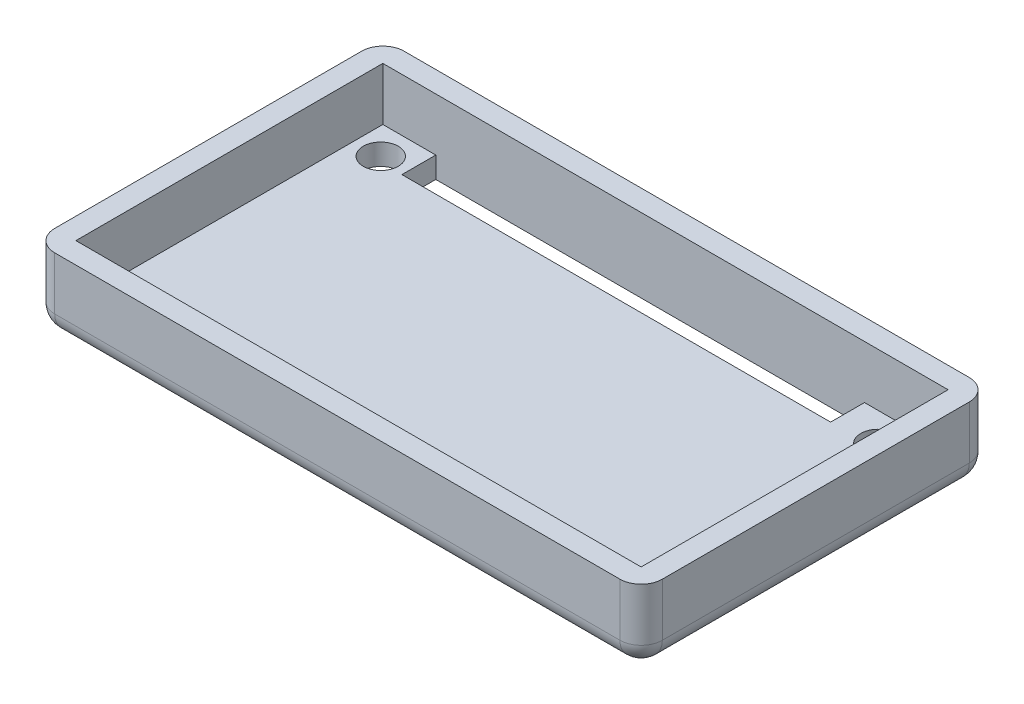
ISO-10303-21;
HEADER;
FILE_DESCRIPTION(('STEP AP214'),'2;1');
FILE_NAME('part.step','',(''),(''),'','','');
FILE_SCHEMA(('AUTOMOTIVE_DESIGN { 1 0 10303 214 1 1 1 1 }'));
ENDSEC;
DATA;
#1=APPLICATION_CONTEXT('core data for automotive mechanical design processes');
#2=APPLICATION_PROTOCOL_DEFINITION('international standard','automotive_design',2000,#1);
#3=PRODUCT_CONTEXT('',#1,'mechanical');
#4=PRODUCT('Part','Part','',(#3));
#5=PRODUCT_RELATED_PRODUCT_CATEGORY('part','',(#4));
#6=PRODUCT_DEFINITION_FORMATION('','',#4);
#7=PRODUCT_DEFINITION_CONTEXT('part definition',#1,'design');
#8=PRODUCT_DEFINITION('design','',#6,#7);
#9=PRODUCT_DEFINITION_SHAPE('','',#8);
#10=(LENGTH_UNIT() NAMED_UNIT(*) SI_UNIT(.MILLI.,.METRE.));
#11=(NAMED_UNIT(*) PLANE_ANGLE_UNIT() SI_UNIT($,.RADIAN.));
#12=(NAMED_UNIT(*) SI_UNIT($,.STERADIAN.) SOLID_ANGLE_UNIT());
#13=UNCERTAINTY_MEASURE_WITH_UNIT(LENGTH_MEASURE(1.E-05),#10,'distance_accuracy_value','');
#14=(GEOMETRIC_REPRESENTATION_CONTEXT(3) GLOBAL_UNCERTAINTY_ASSIGNED_CONTEXT((#13)) GLOBAL_UNIT_ASSIGNED_CONTEXT((#10,
#11,#12)) REPRESENTATION_CONTEXT('',''));
#15=CARTESIAN_POINT('',(0.,0.,0.));
#16=DIRECTION('',(0.,0.,1.));
#17=DIRECTION('',(1.,0.,0.));
#18=AXIS2_PLACEMENT_3D('',#15,#16,#17);
#19=CARTESIAN_POINT('',(0.,7.,0.));
#20=DIRECTION('',(0.,-1.,0.));
#21=DIRECTION('',(0.,0.,-1.));
#22=AXIS2_PLACEMENT_3D('',#19,#20,#21);
#23=PLANE('',#22);
#24=DIRECTION('',(0.,0.,-1.));
#25=VECTOR('',#24,1.);
#26=CARTESIAN_POINT('',(57.4,7.,0.));
#27=LINE('',#26,#25);
#28=CARTESIAN_POINT('',(57.4,7.,-2.));
#29=VERTEX_POINT('',#28);
#30=CARTESIAN_POINT('',(57.4,7.,-31.));
#31=VERTEX_POINT('',#30);
#32=EDGE_CURVE('E317',#29,#31,#27,.T.);
#33=ORIENTED_EDGE('',*,*,#32,.T.);
#34=CARTESIAN_POINT('',(55.4,7.,-31.));
#35=DIRECTION('',(0.,-1.,0.));
#36=DIRECTION('',(0.,0.,-1.));
#37=AXIS2_PLACEMENT_3D('',#34,#35,#36);
#38=CIRCLE('',#37,2.);
#39=CARTESIAN_POINT('',(55.4,7.,-33.));
#40=VERTEX_POINT('',#39);
#41=EDGE_CURVE('E11',#31,#40,#38,.F.);
#42=ORIENTED_EDGE('',*,*,#41,.T.);
#43=DIRECTION('',(-1.,0.,0.));
#44=VECTOR('',#43,1.);
#45=CARTESIAN_POINT('',(0.,7.,-33.));
#46=LINE('',#45,#44);
#47=CARTESIAN_POINT('',(2.,7.,-33.));
#48=VERTEX_POINT('',#47);
#49=EDGE_CURVE('E320',#40,#48,#46,.T.);
#50=ORIENTED_EDGE('',*,*,#49,.T.);
#51=CARTESIAN_POINT('',(2.,7.,-31.));
#52=DIRECTION('',(0.,-1.,0.));
#53=DIRECTION('',(0.,0.,-1.));
#54=AXIS2_PLACEMENT_3D('',#51,#52,#53);
#55=CIRCLE('',#54,2.);
#56=CARTESIAN_POINT('',(0.,7.,-31.));
#57=VERTEX_POINT('',#56);
#58=EDGE_CURVE('E46',#48,#57,#55,.F.);
#59=ORIENTED_EDGE('',*,*,#58,.T.);
#60=DIRECTION('',(0.,0.,1.));
#61=VECTOR('',#60,1.);
#62=CARTESIAN_POINT('',(0.,7.,0.));
#63=LINE('',#62,#61);
#64=CARTESIAN_POINT('',(0.,7.,-2.));
#65=VERTEX_POINT('',#64);
#66=EDGE_CURVE('E311',#57,#65,#63,.T.);
#67=ORIENTED_EDGE('',*,*,#66,.T.);
#68=CARTESIAN_POINT('',(2.,7.,-2.));
#69=DIRECTION('',(0.,-1.,0.));
#70=DIRECTION('',(0.,0.,-1.));
#71=AXIS2_PLACEMENT_3D('',#68,#69,#70);
#72=CIRCLE('',#71,2.);
#73=CARTESIAN_POINT('',(2.,7.,0.));
#74=VERTEX_POINT('',#73);
#75=EDGE_CURVE('E358',#65,#74,#72,.F.);
#76=ORIENTED_EDGE('',*,*,#75,.T.);
#77=DIRECTION('',(1.,0.,0.));
#78=VECTOR('',#77,1.);
#79=CARTESIAN_POINT('',(0.,7.,0.));
#80=LINE('',#79,#78);
#81=CARTESIAN_POINT('',(55.4,7.,0.));
#82=VERTEX_POINT('',#81);
#83=EDGE_CURVE('E314',#74,#82,#80,.T.);
#84=ORIENTED_EDGE('',*,*,#83,.T.);
#85=CARTESIAN_POINT('',(55.4,7.,-2.));
#86=DIRECTION('',(0.,-1.,0.));
#87=DIRECTION('',(0.,0.,-1.));
#88=AXIS2_PLACEMENT_3D('',#85,#86,#87);
#89=CIRCLE('',#88,2.);
#90=EDGE_CURVE('E360',#82,#29,#89,.F.);
#91=ORIENTED_EDGE('',*,*,#90,.T.);
#92=EDGE_LOOP('',(#33,#42,#50,#59,#67,#76,#84,#91));
#93=FACE_BOUND('',#92,.T.);
#94=DIRECTION('',(0.,0.,-1.));
#95=VECTOR('',#94,1.);
#96=CARTESIAN_POINT('',(55.4,7.,0.));
#97=LINE('',#96,#95);
#98=CARTESIAN_POINT('',(55.4,7.,-2.));
#99=VERTEX_POINT('',#98);
#100=CARTESIAN_POINT('',(55.4,7.,-31.));
#101=VERTEX_POINT('',#100);
#102=EDGE_CURVE('E306',#99,#101,#97,.T.);
#103=ORIENTED_EDGE('',*,*,#102,.F.);
#104=DIRECTION('',(1.,0.,0.));
#105=VECTOR('',#104,1.);
#106=CARTESIAN_POINT('',(0.,7.,-2.));
#107=LINE('',#106,#105);
#108=CARTESIAN_POINT('',(2.,7.,-2.));
#109=VERTEX_POINT('',#108);
#110=EDGE_CURVE('E303',#109,#99,#107,.T.);
#111=ORIENTED_EDGE('',*,*,#110,.F.);
#112=DIRECTION('',(0.,0.,1.));
#113=VECTOR('',#112,1.);
#114=CARTESIAN_POINT('',(2.,7.,0.));
#115=LINE('',#114,#113);
#116=CARTESIAN_POINT('',(2.,7.,-31.));
#117=VERTEX_POINT('',#116);
#118=EDGE_CURVE('E274',#117,#109,#115,.T.);
#119=ORIENTED_EDGE('',*,*,#118,.F.);
#120=DIRECTION('',(-1.,0.,0.));
#121=VECTOR('',#120,1.);
#122=CARTESIAN_POINT('',(0.,7.,-31.));
#123=LINE('',#122,#121);
#124=EDGE_CURVE('E296',#101,#117,#123,.T.);
#125=ORIENTED_EDGE('',*,*,#124,.F.);
#126=EDGE_LOOP('',(#103,#111,#119,#125));
#127=FACE_BOUND('',#126,.T.);
#128=ADVANCED_FACE('F37',(#93,#127),#23,.F.);
#129=CARTESIAN_POINT('',(0.,7.,0.));
#130=DIRECTION('',(1.,0.,0.));
#131=DIRECTION('',(0.,0.,-1.));
#132=AXIS2_PLACEMENT_3D('',#129,#130,#131);
#133=PLANE('',#132);
#134=ORIENTED_EDGE('',*,*,#66,.F.);
#135=DIRECTION('',(0.,-1.,0.));
#136=VECTOR('',#135,1.);
#137=CARTESIAN_POINT('',(0.,7.,-31.));
#138=LINE('',#137,#136);
#139=CARTESIAN_POINT('',(0.,2.,-31.));
#140=VERTEX_POINT('',#139);
#141=EDGE_CURVE('E356',#57,#140,#138,.T.);
#142=ORIENTED_EDGE('',*,*,#141,.T.);
#143=DIRECTION('',(0.,0.,1.));
#144=VECTOR('',#143,1.);
#145=CARTESIAN_POINT('',(0.,2.,0.));
#146=LINE('',#145,#144);
#147=CARTESIAN_POINT('',(0.,2.,-2.));
#148=VERTEX_POINT('',#147);
#149=EDGE_CURVE('E354',#140,#148,#146,.T.);
#150=ORIENTED_EDGE('',*,*,#149,.T.);
#151=DIRECTION('',(0.,-1.,0.));
#152=VECTOR('',#151,1.);
#153=CARTESIAN_POINT('',(0.,7.,-2.));
#154=LINE('',#153,#152);
#155=EDGE_CURVE('E352',#148,#65,#154,.F.);
#156=ORIENTED_EDGE('',*,*,#155,.T.);
#157=EDGE_LOOP('',(#134,#142,#150,#156));
#158=FACE_BOUND('',#157,.T.);
#159=ADVANCED_FACE('F408',(#158),#133,.F.);
#160=CARTESIAN_POINT('',(0.,7.,0.));
#161=DIRECTION('',(0.,0.,-1.));
#162=DIRECTION('',(-1.,0.,0.));
#163=AXIS2_PLACEMENT_3D('',#160,#161,#162);
#164=PLANE('',#163);
#165=DIRECTION('',(1.,0.,0.));
#166=VECTOR('',#165,1.);
#167=CARTESIAN_POINT('',(57.4,2.,0.));
#168=LINE('',#167,#166);
#169=CARTESIAN_POINT('',(2.,2.,0.));
#170=VERTEX_POINT('',#169);
#171=CARTESIAN_POINT('',(55.4,2.,0.));
#172=VERTEX_POINT('',#171);
#173=EDGE_CURVE('E325',#170,#172,#168,.T.);
#174=ORIENTED_EDGE('',*,*,#173,.T.);
#175=DIRECTION('',(0.,-1.,0.));
#176=VECTOR('',#175,1.);
#177=CARTESIAN_POINT('',(55.4,7.,0.));
#178=LINE('',#177,#176);
#179=EDGE_CURVE('E328',#172,#82,#178,.F.);
#180=ORIENTED_EDGE('',*,*,#179,.T.);
#181=ORIENTED_EDGE('',*,*,#83,.F.);
#182=DIRECTION('',(0.,-1.,0.));
#183=VECTOR('',#182,1.);
#184=CARTESIAN_POINT('',(2.,7.,0.));
#185=LINE('',#184,#183);
#186=EDGE_CURVE('E323',#74,#170,#185,.T.);
#187=ORIENTED_EDGE('',*,*,#186,.T.);
#188=EDGE_LOOP('',(#174,#180,#181,#187));
#189=FACE_BOUND('',#188,.T.);
#190=ADVANCED_FACE('F421',(#189),#164,.F.);
#191=CARTESIAN_POINT('',(57.4,7.,0.));
#192=DIRECTION('',(-1.,0.,0.));
#193=DIRECTION('',(0.,0.,1.));
#194=AXIS2_PLACEMENT_3D('',#191,#192,#193);
#195=PLANE('',#194);
#196=DIRECTION('',(0.,0.,-1.));
#197=VECTOR('',#196,1.);
#198=CARTESIAN_POINT('',(57.4,2.,-33.));
#199=LINE('',#198,#197);
#200=CARTESIAN_POINT('',(57.4,2.,-2.));
#201=VERTEX_POINT('',#200);
#202=CARTESIAN_POINT('',(57.4,2.,-31.));
#203=VERTEX_POINT('',#202);
#204=EDGE_CURVE('E342',#201,#203,#199,.T.);
#205=ORIENTED_EDGE('',*,*,#204,.T.);
#206=DIRECTION('',(0.,-1.,0.));
#207=VECTOR('',#206,1.);
#208=CARTESIAN_POINT('',(57.4,7.,-31.));
#209=LINE('',#208,#207);
#210=EDGE_CURVE('E344',#203,#31,#209,.F.);
#211=ORIENTED_EDGE('',*,*,#210,.T.);
#212=ORIENTED_EDGE('',*,*,#32,.F.);
#213=DIRECTION('',(0.,-1.,0.));
#214=VECTOR('',#213,1.);
#215=CARTESIAN_POINT('',(57.4,7.,-2.));
#216=LINE('',#215,#214);
#217=EDGE_CURVE('E340',#29,#201,#216,.T.);
#218=ORIENTED_EDGE('',*,*,#217,.T.);
#219=EDGE_LOOP('',(#205,#211,#212,#218));
#220=FACE_BOUND('',#219,.T.);
#221=ADVANCED_FACE('F431',(#220),#195,.F.);
#222=CARTESIAN_POINT('',(0.,7.,-33.));
#223=DIRECTION('',(0.,0.,1.));
#224=DIRECTION('',(1.,0.,0.));
#225=AXIS2_PLACEMENT_3D('',#222,#223,#224);
#226=PLANE('',#225);
#227=ORIENTED_EDGE('',*,*,#49,.F.);
#228=DIRECTION('',(0.,-1.,0.));
#229=VECTOR('',#228,1.);
#230=CARTESIAN_POINT('',(55.4,7.,-33.));
#231=LINE('',#230,#229);
#232=CARTESIAN_POINT('',(55.4,2.,-33.));
#233=VERTEX_POINT('',#232);
#234=EDGE_CURVE('E350',#40,#233,#231,.T.);
#235=ORIENTED_EDGE('',*,*,#234,.T.);
#236=DIRECTION('',(-1.,0.,0.));
#237=VECTOR('',#236,1.);
#238=CARTESIAN_POINT('',(0.,2.,-33.));
#239=LINE('',#238,#237);
#240=CARTESIAN_POINT('',(2.,2.,-33.));
#241=VERTEX_POINT('',#240);
#242=EDGE_CURVE('E348',#233,#241,#239,.T.);
#243=ORIENTED_EDGE('',*,*,#242,.T.);
#244=DIRECTION('',(0.,-1.,0.));
#245=VECTOR('',#244,1.);
#246=CARTESIAN_POINT('',(2.,7.,-33.));
#247=LINE('',#246,#245);
#248=EDGE_CURVE('E346',#241,#48,#247,.F.);
#249=ORIENTED_EDGE('',*,*,#248,.T.);
#250=EDGE_LOOP('',(#227,#235,#243,#249));
#251=FACE_BOUND('',#250,.T.);
#252=ADVANCED_FACE('F452',(#251),#226,.F.);
#253=CARTESIAN_POINT('',(0.,0.,0.));
#254=DIRECTION('',(0.,-1.,0.));
#255=DIRECTION('',(0.,0.,-1.));
#256=AXIS2_PLACEMENT_3D('',#253,#254,#255);
#257=PLANE('',#256);
#258=DIRECTION('',(0.,0.,1.));
#259=VECTOR('',#258,1.);
#260=CARTESIAN_POINT('',(7.,0.,-31.));
#261=LINE('',#260,#259);
#262=CARTESIAN_POINT('',(7.,0.,-31.));
#263=VERTEX_POINT('',#262);
#264=CARTESIAN_POINT('',(7.,0.,-27.8));
#265=VERTEX_POINT('',#264);
#266=EDGE_CURVE('E54',#263,#265,#261,.T.);
#267=ORIENTED_EDGE('',*,*,#266,.T.);
#268=DIRECTION('',(1.,0.,0.));
#269=VECTOR('',#268,1.);
#270=CARTESIAN_POINT('',(7.,0.,-27.8));
#271=LINE('',#270,#269);
#272=CARTESIAN_POINT('',(47.5,0.,-27.8));
#273=VERTEX_POINT('',#272);
#274=EDGE_CURVE('E197',#265,#273,#271,.T.);
#275=ORIENTED_EDGE('',*,*,#274,.T.);
#276=DIRECTION('',(0.,0.,-1.));
#277=VECTOR('',#276,1.);
#278=CARTESIAN_POINT('',(47.5,0.,-31.));
#279=LINE('',#278,#277);
#280=CARTESIAN_POINT('',(47.5,0.,-31.));
#281=VERTEX_POINT('',#280);
#282=EDGE_CURVE('E202',#273,#281,#279,.T.);
#283=ORIENTED_EDGE('',*,*,#282,.T.);
#284=DIRECTION('',(-1.,0.,0.));
#285=VECTOR('',#284,1.);
#286=CARTESIAN_POINT('',(57.4,0.,-31.));
#287=LINE('',#286,#285);
#288=CARTESIAN_POINT('',(55.4,0.,-31.));
#289=VERTEX_POINT('',#288);
#290=EDGE_CURVE('E332',#281,#289,#287,.F.);
#291=ORIENTED_EDGE('',*,*,#290,.T.);
#292=DIRECTION('',(0.,0.,-1.));
#293=VECTOR('',#292,1.);
#294=CARTESIAN_POINT('',(55.4,0.,0.));
#295=LINE('',#294,#293);
#296=CARTESIAN_POINT('',(55.4,0.,-2.));
#297=VERTEX_POINT('',#296);
#298=EDGE_CURVE('E334',#289,#297,#295,.F.);
#299=ORIENTED_EDGE('',*,*,#298,.T.);
#300=DIRECTION('',(1.,0.,0.));
#301=VECTOR('',#300,1.);
#302=CARTESIAN_POINT('',(0.,0.,-2.));
#303=LINE('',#302,#301);
#304=CARTESIAN_POINT('',(47.5,0.,-2.));
#305=VERTEX_POINT('',#304);
#306=EDGE_CURVE('E337',#297,#305,#303,.F.);
#307=ORIENTED_EDGE('',*,*,#306,.T.);
#308=DIRECTION('',(0.,0.,-1.));
#309=VECTOR('',#308,1.);
#310=CARTESIAN_POINT('',(47.5,0.,-2.));
#311=LINE('',#310,#309);
#312=CARTESIAN_POINT('',(47.5,0.,-5.2));
#313=VERTEX_POINT('',#312);
#314=EDGE_CURVE('E62',#305,#313,#311,.T.);
#315=ORIENTED_EDGE('',*,*,#314,.T.);
#316=DIRECTION('',(-1.,0.,0.));
#317=VECTOR('',#316,1.);
#318=CARTESIAN_POINT('',(7.,0.,-5.2));
#319=LINE('',#318,#317);
#320=CARTESIAN_POINT('',(7.,0.,-5.2));
#321=VERTEX_POINT('',#320);
#322=EDGE_CURVE('E247',#313,#321,#319,.T.);
#323=ORIENTED_EDGE('',*,*,#322,.T.);
#324=DIRECTION('',(0.,0.,1.));
#325=VECTOR('',#324,1.);
#326=CARTESIAN_POINT('',(7.,0.,-2.));
#327=LINE('',#326,#325);
#328=CARTESIAN_POINT('',(7.,0.,-2.));
#329=VERTEX_POINT('',#328);
#330=EDGE_CURVE('E229',#321,#329,#327,.T.);
#331=ORIENTED_EDGE('',*,*,#330,.T.);
#332=CARTESIAN_POINT('',(2.,0.,-2.));
#333=VERTEX_POINT('',#332);
#334=EDGE_CURVE('E336',#329,#333,#303,.F.);
#335=ORIENTED_EDGE('',*,*,#334,.T.);
#336=DIRECTION('',(0.,0.,1.));
#337=VECTOR('',#336,1.);
#338=CARTESIAN_POINT('',(2.,0.,-33.));
#339=LINE('',#338,#337);
#340=CARTESIAN_POINT('',(2.,0.,-31.));
#341=VERTEX_POINT('',#340);
#342=EDGE_CURVE('E330',#333,#341,#339,.F.);
#343=ORIENTED_EDGE('',*,*,#342,.T.);
#344=EDGE_CURVE('E208',#341,#263,#287,.F.);
#345=ORIENTED_EDGE('',*,*,#344,.T.);
#346=EDGE_LOOP('',(#267,#275,#283,#291,#299,#307,#315,#323,#331,#335,#343,#345));
#347=FACE_BOUND('',#346,.T.);
#348=CARTESIAN_POINT('',(51.5,0.,-28.3));
#349=DIRECTION('',(0.,1.,0.));
#350=DIRECTION('',(0.,0.,1.));
#351=AXIS2_PLACEMENT_3D('',#348,#349,#350);
#352=CIRCLE('',#351,1.65);
#353=CARTESIAN_POINT('',(51.5,0.,-26.65));
#354=VERTEX_POINT('',#353);
#355=EDGE_CURVE('E263',#354,#354,#352,.T.);
#356=ORIENTED_EDGE('',*,*,#355,.T.);
#357=EDGE_LOOP('',(#356));
#358=FACE_BOUND('',#357,.T.);
#359=CARTESIAN_POINT('',(4.5,0.,-4.7));
#360=DIRECTION('',(0.,1.,0.));
#361=DIRECTION('',(0.,0.,1.));
#362=AXIS2_PLACEMENT_3D('',#359,#360,#361);
#363=CIRCLE('',#362,1.65);
#364=CARTESIAN_POINT('',(4.5,0.,-3.05));
#365=VERTEX_POINT('',#364);
#366=EDGE_CURVE('E256',#365,#365,#363,.T.);
#367=ORIENTED_EDGE('',*,*,#366,.T.);
#368=EDGE_LOOP('',(#367));
#369=FACE_BOUND('',#368,.T.);
#370=CARTESIAN_POINT('',(51.5,0.,-4.7));
#371=DIRECTION('',(0.,1.,0.));
#372=DIRECTION('',(0.,0.,1.));
#373=AXIS2_PLACEMENT_3D('',#370,#371,#372);
#374=CIRCLE('',#373,1.65);
#375=CARTESIAN_POINT('',(51.5,0.,-3.05));
#376=VERTEX_POINT('',#375);
#377=EDGE_CURVE('E223',#376,#376,#374,.T.);
#378=ORIENTED_EDGE('',*,*,#377,.T.);
#379=EDGE_LOOP('',(#378));
#380=FACE_BOUND('',#379,.T.);
#381=CARTESIAN_POINT('',(4.5,0.,-28.3));
#382=DIRECTION('',(0.,1.,0.));
#383=DIRECTION('',(0.,0.,1.));
#384=AXIS2_PLACEMENT_3D('',#381,#382,#383);
#385=CIRCLE('',#384,1.65);
#386=CARTESIAN_POINT('',(4.5,0.,-26.65));
#387=VERTEX_POINT('',#386);
#388=EDGE_CURVE('E271',#387,#387,#385,.T.);
#389=ORIENTED_EDGE('',*,*,#388,.T.);
#390=EDGE_LOOP('',(#389));
#391=FACE_BOUND('',#390,.T.);
#392=ADVANCED_FACE('F205',(#347,#358,#369,#380,#391),#257,.T.);
#393=CARTESIAN_POINT('',(2.,7.,-31.));
#394=DIRECTION('',(0.,-1.,0.));
#395=DIRECTION('',(0.,0.,-1.));
#396=AXIS2_PLACEMENT_3D('',#393,#394,#395);
#397=CYLINDRICAL_SURFACE('',#396,2.);
#398=ORIENTED_EDGE('',*,*,#58,.F.);
#399=ORIENTED_EDGE('',*,*,#248,.F.);
#400=CARTESIAN_POINT('',(2.,2.,-31.));
#401=DIRECTION('',(0.,-1.,0.));
#402=DIRECTION('',(0.,0.,-1.));
#403=AXIS2_PLACEMENT_3D('',#400,#401,#402);
#404=CIRCLE('',#403,2.);
#405=EDGE_CURVE('E390',#140,#241,#404,.T.);
#406=ORIENTED_EDGE('',*,*,#405,.F.);
#407=ORIENTED_EDGE('',*,*,#141,.F.);
#408=EDGE_LOOP('',(#398,#399,#406,#407));
#409=FACE_BOUND('',#408,.T.);
#410=ADVANCED_FACE('F39',(#409),#397,.T.);
#411=CARTESIAN_POINT('',(55.4,7.,-31.));
#412=DIRECTION('',(0.,-1.,0.));
#413=DIRECTION('',(0.,0.,-1.));
#414=AXIS2_PLACEMENT_3D('',#411,#412,#413);
#415=CYLINDRICAL_SURFACE('',#414,2.);
#416=ORIENTED_EDGE('',*,*,#41,.F.);
#417=ORIENTED_EDGE('',*,*,#210,.F.);
#418=CARTESIAN_POINT('',(55.4,2.,-31.));
#419=DIRECTION('',(0.,-1.,0.));
#420=DIRECTION('',(0.,0.,-1.));
#421=AXIS2_PLACEMENT_3D('',#418,#419,#420);
#422=CIRCLE('',#421,2.);
#423=EDGE_CURVE('E388',#233,#203,#422,.T.);
#424=ORIENTED_EDGE('',*,*,#423,.F.);
#425=ORIENTED_EDGE('',*,*,#234,.F.);
#426=EDGE_LOOP('',(#416,#417,#424,#425));
#427=FACE_BOUND('',#426,.T.);
#428=ADVANCED_FACE('F436',(#427),#415,.T.);
#429=CARTESIAN_POINT('',(0.,2.,-31.));
#430=DIRECTION('',(1.,0.,0.));
#431=DIRECTION('',(0.,0.,-1.));
#432=AXIS2_PLACEMENT_3D('',#429,#430,#431);
#433=CYLINDRICAL_SURFACE('',#432,2.);
#434=CARTESIAN_POINT('',(2.,2.,-31.));
#435=DIRECTION('',(-1.,0.,0.));
#436=DIRECTION('',(0.,0.,1.));
#437=AXIS2_PLACEMENT_3D('',#434,#435,#436);
#438=CIRCLE('',#437,2.);
#439=EDGE_CURVE('E41',#241,#341,#438,.T.);
#440=ORIENTED_EDGE('',*,*,#439,.F.);
#441=ORIENTED_EDGE('',*,*,#242,.F.);
#442=CARTESIAN_POINT('',(55.4,2.,-31.));
#443=DIRECTION('',(1.,0.,0.));
#444=DIRECTION('',(0.,0.,-1.));
#445=AXIS2_PLACEMENT_3D('',#442,#443,#444);
#446=CIRCLE('',#445,2.);
#447=EDGE_CURVE('E385',#289,#233,#446,.T.);
#448=ORIENTED_EDGE('',*,*,#447,.F.);
#449=ORIENTED_EDGE('',*,*,#290,.F.);
#450=DIRECTION('',(-1.,0.,0.));
#451=VECTOR('',#450,1.);
#452=CARTESIAN_POINT('',(7.,0.,-31.));
#453=LINE('',#452,#451);
#454=EDGE_CURVE('E194',#281,#263,#453,.T.);
#455=ORIENTED_EDGE('',*,*,#454,.T.);
#456=ORIENTED_EDGE('',*,*,#344,.F.);
#457=EDGE_LOOP('',(#440,#441,#448,#449,#455,#456));
#458=FACE_BOUND('',#457,.T.);
#459=ADVANCED_FACE('F448',(#458),#433,.T.);
#460=CARTESIAN_POINT('',(2.,2.,-31.));
#461=DIRECTION('',(0.,0.,-1.));
#462=DIRECTION('',(-1.,0.,0.));
#463=AXIS2_PLACEMENT_3D('',#460,#461,#462);
#464=SPHERICAL_SURFACE('',#463,2.);
#465=ORIENTED_EDGE('',*,*,#405,.T.);
#466=ORIENTED_EDGE('',*,*,#439,.T.);
#467=CARTESIAN_POINT('',(2.,2.,-31.));
#468=DIRECTION('',(0.,0.,-1.));
#469=DIRECTION('',(-1.,0.,0.));
#470=AXIS2_PLACEMENT_3D('',#467,#468,#469);
#471=CIRCLE('',#470,2.);
#472=EDGE_CURVE('E382',#140,#341,#471,.F.);
#473=ORIENTED_EDGE('',*,*,#472,.F.);
#474=EDGE_LOOP('',(#465,#466,#473));
#475=FACE_BOUND('',#474,.T.);
#476=ADVANCED_FACE('F397',(#475),#464,.T.);
#477=CARTESIAN_POINT('',(55.4,2.,-31.));
#478=DIRECTION('',(0.,0.,-1.));
#479=DIRECTION('',(-1.,0.,0.));
#480=AXIS2_PLACEMENT_3D('',#477,#478,#479);
#481=SPHERICAL_SURFACE('',#480,2.);
#482=ORIENTED_EDGE('',*,*,#447,.T.);
#483=ORIENTED_EDGE('',*,*,#423,.T.);
#484=CARTESIAN_POINT('',(55.4,2.,-31.));
#485=DIRECTION('',(0.,0.,-1.));
#486=DIRECTION('',(-1.,0.,0.));
#487=AXIS2_PLACEMENT_3D('',#484,#485,#486);
#488=CIRCLE('',#487,2.);
#489=EDGE_CURVE('E379',#289,#203,#488,.F.);
#490=ORIENTED_EDGE('',*,*,#489,.F.);
#491=EDGE_LOOP('',(#482,#483,#490));
#492=FACE_BOUND('',#491,.T.);
#493=ADVANCED_FACE('F440',(#492),#481,.T.);
#494=CARTESIAN_POINT('',(2.,2.,0.));
#495=DIRECTION('',(0.,0.,-1.));
#496=DIRECTION('',(-1.,0.,0.));
#497=AXIS2_PLACEMENT_3D('',#494,#495,#496);
#498=CYLINDRICAL_SURFACE('',#497,2.);
#499=ORIENTED_EDGE('',*,*,#472,.T.);
#500=ORIENTED_EDGE('',*,*,#342,.F.);
#501=CARTESIAN_POINT('',(2.,2.,-2.));
#502=DIRECTION('',(0.,0.,1.));
#503=DIRECTION('',(1.,0.,0.));
#504=AXIS2_PLACEMENT_3D('',#501,#502,#503);
#505=CIRCLE('',#504,2.);
#506=EDGE_CURVE('E376',#148,#333,#505,.T.);
#507=ORIENTED_EDGE('',*,*,#506,.F.);
#508=ORIENTED_EDGE('',*,*,#149,.F.);
#509=EDGE_LOOP('',(#499,#500,#507,#508));
#510=FACE_BOUND('',#509,.T.);
#511=ADVANCED_FACE('F403',(#510),#498,.T.);
#512=CARTESIAN_POINT('',(2.,7.,-2.));
#513=DIRECTION('',(0.,-1.,0.));
#514=DIRECTION('',(0.,0.,-1.));
#515=AXIS2_PLACEMENT_3D('',#512,#513,#514);
#516=CYLINDRICAL_SURFACE('',#515,2.);
#517=ORIENTED_EDGE('',*,*,#75,.F.);
#518=ORIENTED_EDGE('',*,*,#155,.F.);
#519=CARTESIAN_POINT('',(2.,2.,-2.));
#520=DIRECTION('',(0.,-1.,0.));
#521=DIRECTION('',(0.,0.,-1.));
#522=AXIS2_PLACEMENT_3D('',#519,#520,#521);
#523=CIRCLE('',#522,2.);
#524=EDGE_CURVE('E373',#170,#148,#523,.T.);
#525=ORIENTED_EDGE('',*,*,#524,.F.);
#526=ORIENTED_EDGE('',*,*,#186,.F.);
#527=EDGE_LOOP('',(#517,#518,#525,#526));
#528=FACE_BOUND('',#527,.T.);
#529=ADVANCED_FACE('F413',(#528),#516,.T.);
#530=CARTESIAN_POINT('',(55.4,7.,-2.));
#531=DIRECTION('',(0.,-1.,0.));
#532=DIRECTION('',(0.,0.,-1.));
#533=AXIS2_PLACEMENT_3D('',#530,#531,#532);
#534=CYLINDRICAL_SURFACE('',#533,2.);
#535=ORIENTED_EDGE('',*,*,#90,.F.);
#536=ORIENTED_EDGE('',*,*,#179,.F.);
#537=CARTESIAN_POINT('',(55.4,2.,-2.));
#538=DIRECTION('',(0.,-1.,0.));
#539=DIRECTION('',(0.,0.,-1.));
#540=AXIS2_PLACEMENT_3D('',#537,#538,#539);
#541=CIRCLE('',#540,2.);
#542=EDGE_CURVE('E370',#201,#172,#541,.T.);
#543=ORIENTED_EDGE('',*,*,#542,.F.);
#544=ORIENTED_EDGE('',*,*,#217,.F.);
#545=EDGE_LOOP('',(#535,#536,#543,#544));
#546=FACE_BOUND('',#545,.T.);
#547=ADVANCED_FACE('F426',(#546),#534,.T.);
#548=CARTESIAN_POINT('',(55.4,2.,0.));
#549=DIRECTION('',(0.,0.,1.));
#550=DIRECTION('',(1.,0.,0.));
#551=AXIS2_PLACEMENT_3D('',#548,#549,#550);
#552=CYLINDRICAL_SURFACE('',#551,2.);
#553=ORIENTED_EDGE('',*,*,#489,.T.);
#554=ORIENTED_EDGE('',*,*,#204,.F.);
#555=CARTESIAN_POINT('',(55.4,2.,-2.));
#556=DIRECTION('',(0.,0.,1.));
#557=DIRECTION('',(1.,0.,0.));
#558=AXIS2_PLACEMENT_3D('',#555,#556,#557);
#559=CIRCLE('',#558,2.);
#560=EDGE_CURVE('E367',#297,#201,#559,.T.);
#561=ORIENTED_EDGE('',*,*,#560,.F.);
#562=ORIENTED_EDGE('',*,*,#298,.F.);
#563=EDGE_LOOP('',(#553,#554,#561,#562));
#564=FACE_BOUND('',#563,.T.);
#565=ADVANCED_FACE('F444',(#564),#552,.T.);
#566=CARTESIAN_POINT('',(2.,2.,-2.));
#567=DIRECTION('',(-1.,0.,0.));
#568=DIRECTION('',(0.,0.,1.));
#569=AXIS2_PLACEMENT_3D('',#566,#567,#568);
#570=SPHERICAL_SURFACE('',#569,2.);
#571=ORIENTED_EDGE('',*,*,#524,.T.);
#572=ORIENTED_EDGE('',*,*,#506,.T.);
#573=CARTESIAN_POINT('',(2.,2.,-2.));
#574=DIRECTION('',(-1.,0.,0.));
#575=DIRECTION('',(0.,0.,1.));
#576=AXIS2_PLACEMENT_3D('',#573,#574,#575);
#577=CIRCLE('',#576,2.);
#578=EDGE_CURVE('E364',#170,#333,#577,.F.);
#579=ORIENTED_EDGE('',*,*,#578,.F.);
#580=EDGE_LOOP('',(#571,#572,#579));
#581=FACE_BOUND('',#580,.T.);
#582=ADVANCED_FACE('F485',(#581),#570,.T.);
#583=CARTESIAN_POINT('',(55.4,2.,-2.));
#584=DIRECTION('',(1.,0.,0.));
#585=DIRECTION('',(0.,0.,-1.));
#586=AXIS2_PLACEMENT_3D('',#583,#584,#585);
#587=SPHERICAL_SURFACE('',#586,2.);
#588=ORIENTED_EDGE('',*,*,#560,.T.);
#589=ORIENTED_EDGE('',*,*,#542,.T.);
#590=CARTESIAN_POINT('',(55.4,2.,-2.));
#591=DIRECTION('',(1.,0.,0.));
#592=DIRECTION('',(0.,0.,-1.));
#593=AXIS2_PLACEMENT_3D('',#590,#591,#592);
#594=CIRCLE('',#593,2.);
#595=EDGE_CURVE('E289',#297,#172,#594,.F.);
#596=ORIENTED_EDGE('',*,*,#595,.F.);
#597=EDGE_LOOP('',(#588,#589,#596));
#598=FACE_BOUND('',#597,.T.);
#599=ADVANCED_FACE('F481',(#598),#587,.T.);
#600=CARTESIAN_POINT('',(0.,2.,-2.));
#601=DIRECTION('',(-1.,0.,0.));
#602=DIRECTION('',(0.,0.,1.));
#603=AXIS2_PLACEMENT_3D('',#600,#601,#602);
#604=CYLINDRICAL_SURFACE('',#603,2.);
#605=ORIENTED_EDGE('',*,*,#578,.T.);
#606=ORIENTED_EDGE('',*,*,#334,.F.);
#607=DIRECTION('',(1.,0.,0.));
#608=VECTOR('',#607,1.);
#609=CARTESIAN_POINT('',(7.,0.,-2.));
#610=LINE('',#609,#608);
#611=EDGE_CURVE('E240',#329,#305,#610,.T.);
#612=ORIENTED_EDGE('',*,*,#611,.T.);
#613=ORIENTED_EDGE('',*,*,#306,.F.);
#614=ORIENTED_EDGE('',*,*,#595,.T.);
#615=ORIENTED_EDGE('',*,*,#173,.F.);
#616=EDGE_LOOP('',(#605,#606,#612,#613,#614,#615));
#617=FACE_BOUND('',#616,.T.);
#618=ADVANCED_FACE('F477',(#617),#604,.T.);
#619=CARTESIAN_POINT('',(2.,7.,0.));
#620=DIRECTION('',(1.,0.,0.));
#621=DIRECTION('',(0.,0.,-1.));
#622=AXIS2_PLACEMENT_3D('',#619,#620,#621);
#623=PLANE('',#622);
#624=ORIENTED_EDGE('',*,*,#118,.T.);
#625=DIRECTION('',(0.,1.,0.));
#626=VECTOR('',#625,1.);
#627=CARTESIAN_POINT('',(2.,7.,-2.));
#628=LINE('',#627,#626);
#629=CARTESIAN_POINT('',(2.,2.,-2.));
#630=VERTEX_POINT('',#629);
#631=EDGE_CURVE('E286',#630,#109,#628,.T.);
#632=ORIENTED_EDGE('',*,*,#631,.F.);
#633=DIRECTION('',(0.,0.,-1.));
#634=VECTOR('',#633,1.);
#635=CARTESIAN_POINT('',(2.,2.,0.));
#636=LINE('',#635,#634);
#637=CARTESIAN_POINT('',(2.,2.,-31.));
#638=VERTEX_POINT('',#637);
#639=EDGE_CURVE('E281',#630,#638,#636,.T.);
#640=ORIENTED_EDGE('',*,*,#639,.T.);
#641=DIRECTION('',(0.,1.,0.));
#642=VECTOR('',#641,1.);
#643=CARTESIAN_POINT('',(2.,7.,-31.));
#644=LINE('',#643,#642);
#645=EDGE_CURVE('E277',#638,#117,#644,.T.);
#646=ORIENTED_EDGE('',*,*,#645,.T.);
#647=EDGE_LOOP('',(#624,#632,#640,#646));
#648=FACE_BOUND('',#647,.T.);
#649=ADVANCED_FACE('F480',(#648),#623,.T.);
#650=CARTESIAN_POINT('',(0.,7.,-2.));
#651=DIRECTION('',(0.,0.,-1.));
#652=DIRECTION('',(-1.,0.,0.));
#653=AXIS2_PLACEMENT_3D('',#650,#651,#652);
#654=PLANE('',#653);
#655=DIRECTION('',(-1.,0.,0.));
#656=VECTOR('',#655,1.);
#657=CARTESIAN_POINT('',(0.,2.,-2.));
#658=LINE('',#657,#656);
#659=CARTESIAN_POINT('',(55.4,2.,-2.));
#660=VERTEX_POINT('',#659);
#661=CARTESIAN_POINT('',(47.5,2.,-2.));
#662=VERTEX_POINT('',#661);
#663=EDGE_CURVE('E291',#660,#662,#658,.T.);
#664=ORIENTED_EDGE('',*,*,#663,.T.);
#665=DIRECTION('',(0.,1.,0.));
#666=VECTOR('',#665,1.);
#667=CARTESIAN_POINT('',(47.5,0.,-2.));
#668=LINE('',#667,#666);
#669=EDGE_CURVE('E227',#305,#662,#668,.T.);
#670=ORIENTED_EDGE('',*,*,#669,.F.);
#671=ORIENTED_EDGE('',*,*,#611,.F.);
#672=DIRECTION('',(0.,1.,0.));
#673=VECTOR('',#672,1.);
#674=CARTESIAN_POINT('',(7.,0.,-2.));
#675=LINE('',#674,#673);
#676=CARTESIAN_POINT('',(7.,2.,-2.));
#677=VERTEX_POINT('',#676);
#678=EDGE_CURVE('E234',#329,#677,#675,.T.);
#679=ORIENTED_EDGE('',*,*,#678,.T.);
#680=EDGE_CURVE('E284',#677,#630,#658,.T.);
#681=ORIENTED_EDGE('',*,*,#680,.T.);
#682=ORIENTED_EDGE('',*,*,#631,.T.);
#683=ORIENTED_EDGE('',*,*,#110,.T.);
#684=DIRECTION('',(0.,1.,0.));
#685=VECTOR('',#684,1.);
#686=CARTESIAN_POINT('',(55.4,7.,-2.));
#687=LINE('',#686,#685);
#688=EDGE_CURVE('E285',#660,#99,#687,.T.);
#689=ORIENTED_EDGE('',*,*,#688,.F.);
#690=EDGE_LOOP('',(#664,#670,#671,#679,#681,#682,#683,#689));
#691=FACE_BOUND('',#690,.T.);
#692=ADVANCED_FACE('F551',(#691),#654,.T.);
#693=CARTESIAN_POINT('',(55.4,7.,0.));
#694=DIRECTION('',(-1.,0.,0.));
#695=DIRECTION('',(0.,0.,1.));
#696=AXIS2_PLACEMENT_3D('',#693,#694,#695);
#697=PLANE('',#696);
#698=DIRECTION('',(0.,0.,-1.));
#699=VECTOR('',#698,1.);
#700=CARTESIAN_POINT('',(55.4,2.,0.));
#701=LINE('',#700,#699);
#702=CARTESIAN_POINT('',(55.4,2.,-31.));
#703=VERTEX_POINT('',#702);
#704=EDGE_CURVE('E294',#660,#703,#701,.T.);
#705=ORIENTED_EDGE('',*,*,#704,.F.);
#706=ORIENTED_EDGE('',*,*,#688,.T.);
#707=ORIENTED_EDGE('',*,*,#102,.T.);
#708=DIRECTION('',(0.,1.,0.));
#709=VECTOR('',#708,1.);
#710=CARTESIAN_POINT('',(55.4,7.,-31.));
#711=LINE('',#710,#709);
#712=EDGE_CURVE('E280',#703,#101,#711,.T.);
#713=ORIENTED_EDGE('',*,*,#712,.F.);
#714=EDGE_LOOP('',(#705,#706,#707,#713));
#715=FACE_BOUND('',#714,.T.);
#716=ADVANCED_FACE('F559',(#715),#697,.T.);
#717=CARTESIAN_POINT('',(0.,7.,-31.));
#718=DIRECTION('',(0.,0.,1.));
#719=DIRECTION('',(1.,0.,0.));
#720=AXIS2_PLACEMENT_3D('',#717,#718,#719);
#721=PLANE('',#720);
#722=ORIENTED_EDGE('',*,*,#124,.T.);
#723=ORIENTED_EDGE('',*,*,#645,.F.);
#724=DIRECTION('',(-1.,0.,0.));
#725=VECTOR('',#724,1.);
#726=CARTESIAN_POINT('',(0.,2.,-31.));
#727=LINE('',#726,#725);
#728=CARTESIAN_POINT('',(7.,2.,-31.));
#729=VERTEX_POINT('',#728);
#730=EDGE_CURVE('E279',#729,#638,#727,.T.);
#731=ORIENTED_EDGE('',*,*,#730,.F.);
#732=DIRECTION('',(0.,1.,0.));
#733=VECTOR('',#732,1.);
#734=CARTESIAN_POINT('',(7.,0.,-31.));
#735=LINE('',#734,#733);
#736=EDGE_CURVE('E221',#263,#729,#735,.T.);
#737=ORIENTED_EDGE('',*,*,#736,.F.);
#738=ORIENTED_EDGE('',*,*,#454,.F.);
#739=DIRECTION('',(0.,1.,0.));
#740=VECTOR('',#739,1.);
#741=CARTESIAN_POINT('',(47.5,0.,-31.));
#742=LINE('',#741,#740);
#743=CARTESIAN_POINT('',(47.5,2.,-31.));
#744=VERTEX_POINT('',#743);
#745=EDGE_CURVE('E224',#281,#744,#742,.T.);
#746=ORIENTED_EDGE('',*,*,#745,.T.);
#747=EDGE_CURVE('E290',#703,#744,#727,.T.);
#748=ORIENTED_EDGE('',*,*,#747,.F.);
#749=ORIENTED_EDGE('',*,*,#712,.T.);
#750=EDGE_LOOP('',(#722,#723,#731,#737,#738,#746,#748,#749));
#751=FACE_BOUND('',#750,.T.);
#752=ADVANCED_FACE('F567',(#751),#721,.T.);
#753=CARTESIAN_POINT('',(0.,2.,0.));
#754=DIRECTION('',(0.,-1.,0.));
#755=DIRECTION('',(0.,0.,-1.));
#756=AXIS2_PLACEMENT_3D('',#753,#754,#755);
#757=PLANE('',#756);
#758=CARTESIAN_POINT('',(51.5,2.,-28.3));
#759=DIRECTION('',(0.,1.,0.));
#760=DIRECTION('',(0.,0.,1.));
#761=AXIS2_PLACEMENT_3D('',#758,#759,#760);
#762=CIRCLE('',#761,1.65);
#763=CARTESIAN_POINT('',(51.5,2.,-26.65));
#764=VERTEX_POINT('',#763);
#765=EDGE_CURVE('E259',#764,#764,#762,.T.);
#766=ORIENTED_EDGE('',*,*,#765,.F.);
#767=EDGE_LOOP('',(#766));
#768=FACE_BOUND('',#767,.T.);
#769=CARTESIAN_POINT('',(4.5,2.,-4.7));
#770=DIRECTION('',(0.,1.,0.));
#771=DIRECTION('',(0.,0.,1.));
#772=AXIS2_PLACEMENT_3D('',#769,#770,#771);
#773=CIRCLE('',#772,1.65);
#774=CARTESIAN_POINT('',(4.5,2.,-3.05));
#775=VERTEX_POINT('',#774);
#776=EDGE_CURVE('E266',#775,#775,#773,.T.);
#777=ORIENTED_EDGE('',*,*,#776,.F.);
#778=EDGE_LOOP('',(#777));
#779=FACE_BOUND('',#778,.T.);
#780=CARTESIAN_POINT('',(51.5,2.,-4.7));
#781=DIRECTION('',(0.,1.,0.));
#782=DIRECTION('',(0.,0.,1.));
#783=AXIS2_PLACEMENT_3D('',#780,#781,#782);
#784=CIRCLE('',#783,1.65);
#785=CARTESIAN_POINT('',(51.5,2.,-3.05));
#786=VERTEX_POINT('',#785);
#787=EDGE_CURVE('E253',#786,#786,#784,.T.);
#788=ORIENTED_EDGE('',*,*,#787,.F.);
#789=EDGE_LOOP('',(#788));
#790=FACE_BOUND('',#789,.T.);
#791=CARTESIAN_POINT('',(4.5,2.,-28.3));
#792=DIRECTION('',(0.,1.,0.));
#793=DIRECTION('',(0.,0.,1.));
#794=AXIS2_PLACEMENT_3D('',#791,#792,#793);
#795=CIRCLE('',#794,1.65);
#796=CARTESIAN_POINT('',(4.5,2.,-26.65));
#797=VERTEX_POINT('',#796);
#798=EDGE_CURVE('E262',#797,#797,#795,.T.);
#799=ORIENTED_EDGE('',*,*,#798,.F.);
#800=EDGE_LOOP('',(#799));
#801=FACE_BOUND('',#800,.T.);
#802=DIRECTION('',(1.,0.,0.));
#803=VECTOR('',#802,1.);
#804=CARTESIAN_POINT('',(7.,2.,-27.8));
#805=LINE('',#804,#803);
#806=CARTESIAN_POINT('',(7.,2.,-27.8));
#807=VERTEX_POINT('',#806);
#808=CARTESIAN_POINT('',(47.5,2.,-27.8));
#809=VERTEX_POINT('',#808);
#810=EDGE_CURVE('E212',#807,#809,#805,.T.);
#811=ORIENTED_EDGE('',*,*,#810,.F.);
#812=DIRECTION('',(0.,0.,1.));
#813=VECTOR('',#812,1.);
#814=CARTESIAN_POINT('',(7.,2.,-31.));
#815=LINE('',#814,#813);
#816=EDGE_CURVE('E189',#729,#807,#815,.T.);
#817=ORIENTED_EDGE('',*,*,#816,.F.);
#818=ORIENTED_EDGE('',*,*,#730,.T.);
#819=ORIENTED_EDGE('',*,*,#639,.F.);
#820=ORIENTED_EDGE('',*,*,#680,.F.);
#821=DIRECTION('',(0.,0.,1.));
#822=VECTOR('',#821,1.);
#823=CARTESIAN_POINT('',(7.,2.,-2.));
#824=LINE('',#823,#822);
#825=CARTESIAN_POINT('',(7.,2.,-5.2));
#826=VERTEX_POINT('',#825);
#827=EDGE_CURVE('E236',#826,#677,#824,.T.);
#828=ORIENTED_EDGE('',*,*,#827,.F.);
#829=DIRECTION('',(-1.,0.,0.));
#830=VECTOR('',#829,1.);
#831=CARTESIAN_POINT('',(7.,2.,-5.2));
#832=LINE('',#831,#830);
#833=CARTESIAN_POINT('',(47.5,2.,-5.2));
#834=VERTEX_POINT('',#833);
#835=EDGE_CURVE('E239',#834,#826,#832,.T.);
#836=ORIENTED_EDGE('',*,*,#835,.F.);
#837=DIRECTION('',(0.,0.,-1.));
#838=VECTOR('',#837,1.);
#839=CARTESIAN_POINT('',(47.5,2.,-2.));
#840=LINE('',#839,#838);
#841=EDGE_CURVE('E219',#662,#834,#840,.T.);
#842=ORIENTED_EDGE('',*,*,#841,.F.);
#843=ORIENTED_EDGE('',*,*,#663,.F.);
#844=ORIENTED_EDGE('',*,*,#704,.T.);
#845=ORIENTED_EDGE('',*,*,#747,.T.);
#846=DIRECTION('',(0.,0.,-1.));
#847=VECTOR('',#846,1.);
#848=CARTESIAN_POINT('',(47.5,2.,-31.));
#849=LINE('',#848,#847);
#850=EDGE_CURVE('E209',#809,#744,#849,.T.);
#851=ORIENTED_EDGE('',*,*,#850,.F.);
#852=EDGE_LOOP('',(#811,#817,#818,#819,#820,#828,#836,#842,#843,#844,#845,#851));
#853=FACE_BOUND('',#852,.T.);
#854=ADVANCED_FACE('F468',(#768,#779,#790,#801,#853),#757,.F.);
#855=CARTESIAN_POINT('',(4.5,0.,-28.3));
#856=DIRECTION('',(0.,1.,0.));
#857=DIRECTION('',(0.,0.,1.));
#858=AXIS2_PLACEMENT_3D('',#855,#856,#857);
#859=CYLINDRICAL_SURFACE('',#858,1.65);
#860=ORIENTED_EDGE('',*,*,#388,.F.);
#861=EDGE_LOOP('',(#860));
#862=FACE_BOUND('',#861,.T.);
#863=ORIENTED_EDGE('',*,*,#798,.T.);
#864=EDGE_LOOP('',(#863));
#865=FACE_BOUND('',#864,.T.);
#866=ADVANCED_FACE('F581',(#862,#865),#859,.F.);
#867=CARTESIAN_POINT('',(51.5,0.,-4.7));
#868=DIRECTION('',(0.,1.,0.));
#869=DIRECTION('',(0.,0.,1.));
#870=AXIS2_PLACEMENT_3D('',#867,#868,#869);
#871=CYLINDRICAL_SURFACE('',#870,1.65);
#872=ORIENTED_EDGE('',*,*,#377,.F.);
#873=EDGE_LOOP('',(#872));
#874=FACE_BOUND('',#873,.T.);
#875=ORIENTED_EDGE('',*,*,#787,.T.);
#876=EDGE_LOOP('',(#875));
#877=FACE_BOUND('',#876,.T.);
#878=ADVANCED_FACE('F588',(#874,#877),#871,.F.);
#879=CARTESIAN_POINT('',(4.5,0.,-4.7));
#880=DIRECTION('',(0.,1.,0.));
#881=DIRECTION('',(0.,0.,1.));
#882=AXIS2_PLACEMENT_3D('',#879,#880,#881);
#883=CYLINDRICAL_SURFACE('',#882,1.65);
#884=ORIENTED_EDGE('',*,*,#366,.F.);
#885=EDGE_LOOP('',(#884));
#886=FACE_BOUND('',#885,.T.);
#887=ORIENTED_EDGE('',*,*,#776,.T.);
#888=EDGE_LOOP('',(#887));
#889=FACE_BOUND('',#888,.T.);
#890=ADVANCED_FACE('F596',(#886,#889),#883,.F.);
#891=CARTESIAN_POINT('',(51.5,0.,-28.3));
#892=DIRECTION('',(0.,1.,0.));
#893=DIRECTION('',(0.,0.,1.));
#894=AXIS2_PLACEMENT_3D('',#891,#892,#893);
#895=CYLINDRICAL_SURFACE('',#894,1.65);
#896=ORIENTED_EDGE('',*,*,#355,.F.);
#897=EDGE_LOOP('',(#896));
#898=FACE_BOUND('',#897,.T.);
#899=ORIENTED_EDGE('',*,*,#765,.T.);
#900=EDGE_LOOP('',(#899));
#901=FACE_BOUND('',#900,.T.);
#902=ADVANCED_FACE('F604',(#898,#901),#895,.F.);
#903=CARTESIAN_POINT('',(7.,0.,-2.));
#904=DIRECTION('',(-1.,0.,0.));
#905=DIRECTION('',(0.,0.,1.));
#906=AXIS2_PLACEMENT_3D('',#903,#904,#905);
#907=PLANE('',#906);
#908=ORIENTED_EDGE('',*,*,#827,.T.);
#909=ORIENTED_EDGE('',*,*,#678,.F.);
#910=ORIENTED_EDGE('',*,*,#330,.F.);
#911=DIRECTION('',(0.,1.,0.));
#912=VECTOR('',#911,1.);
#913=CARTESIAN_POINT('',(7.,0.,-5.2));
#914=LINE('',#913,#912);
#915=EDGE_CURVE('E232',#321,#826,#914,.T.);
#916=ORIENTED_EDGE('',*,*,#915,.T.);
#917=EDGE_LOOP('',(#908,#909,#910,#916));
#918=FACE_BOUND('',#917,.T.);
#919=ADVANCED_FACE('F612',(#918),#907,.F.);
#920=CARTESIAN_POINT('',(7.,0.,-5.2));
#921=DIRECTION('',(0.,0.,-1.));
#922=DIRECTION('',(-1.,0.,0.));
#923=AXIS2_PLACEMENT_3D('',#920,#921,#922);
#924=PLANE('',#923);
#925=ORIENTED_EDGE('',*,*,#835,.T.);
#926=ORIENTED_EDGE('',*,*,#915,.F.);
#927=ORIENTED_EDGE('',*,*,#322,.F.);
#928=DIRECTION('',(0.,1.,0.));
#929=VECTOR('',#928,1.);
#930=CARTESIAN_POINT('',(47.5,0.,-5.2));
#931=LINE('',#930,#929);
#932=EDGE_CURVE('E230',#313,#834,#931,.T.);
#933=ORIENTED_EDGE('',*,*,#932,.T.);
#934=EDGE_LOOP('',(#925,#926,#927,#933));
#935=FACE_BOUND('',#934,.T.);
#936=ADVANCED_FACE('F619',(#935),#924,.F.);
#937=CARTESIAN_POINT('',(47.5,0.,-2.));
#938=DIRECTION('',(1.,0.,0.));
#939=DIRECTION('',(0.,0.,-1.));
#940=AXIS2_PLACEMENT_3D('',#937,#938,#939);
#941=PLANE('',#940);
#942=ORIENTED_EDGE('',*,*,#841,.T.);
#943=ORIENTED_EDGE('',*,*,#932,.F.);
#944=ORIENTED_EDGE('',*,*,#314,.F.);
#945=ORIENTED_EDGE('',*,*,#669,.T.);
#946=EDGE_LOOP('',(#942,#943,#944,#945));
#947=FACE_BOUND('',#946,.T.);
#948=ADVANCED_FACE('F627',(#947),#941,.F.);
#949=CARTESIAN_POINT('',(7.,0.,-31.));
#950=DIRECTION('',(-1.,0.,0.));
#951=DIRECTION('',(0.,0.,1.));
#952=AXIS2_PLACEMENT_3D('',#949,#950,#951);
#953=PLANE('',#952);
#954=ORIENTED_EDGE('',*,*,#816,.T.);
#955=DIRECTION('',(0.,1.,0.));
#956=VECTOR('',#955,1.);
#957=CARTESIAN_POINT('',(7.,0.,-27.8));
#958=LINE('',#957,#956);
#959=EDGE_CURVE('E185',#265,#807,#958,.T.);
#960=ORIENTED_EDGE('',*,*,#959,.F.);
#961=ORIENTED_EDGE('',*,*,#266,.F.);
#962=ORIENTED_EDGE('',*,*,#736,.T.);
#963=EDGE_LOOP('',(#954,#960,#961,#962));
#964=FACE_BOUND('',#963,.T.);
#965=ADVANCED_FACE('F187',(#964),#953,.F.);
#966=CARTESIAN_POINT('',(47.5,0.,-31.));
#967=DIRECTION('',(1.,0.,0.));
#968=DIRECTION('',(0.,0.,-1.));
#969=AXIS2_PLACEMENT_3D('',#966,#967,#968);
#970=PLANE('',#969);
#971=ORIENTED_EDGE('',*,*,#850,.T.);
#972=ORIENTED_EDGE('',*,*,#745,.F.);
#973=ORIENTED_EDGE('',*,*,#282,.F.);
#974=DIRECTION('',(0.,1.,0.));
#975=VECTOR('',#974,1.);
#976=CARTESIAN_POINT('',(47.5,0.,-27.8));
#977=LINE('',#976,#975);
#978=EDGE_CURVE('E193',#273,#809,#977,.T.);
#979=ORIENTED_EDGE('',*,*,#978,.T.);
#980=EDGE_LOOP('',(#971,#972,#973,#979));
#981=FACE_BOUND('',#980,.T.);
#982=ADVANCED_FACE('F641',(#981),#970,.F.);
#983=CARTESIAN_POINT('',(7.,0.,-27.8));
#984=DIRECTION('',(0.,0.,1.));
#985=DIRECTION('',(1.,0.,0.));
#986=AXIS2_PLACEMENT_3D('',#983,#984,#985);
#987=PLANE('',#986);
#988=ORIENTED_EDGE('',*,*,#810,.T.);
#989=ORIENTED_EDGE('',*,*,#978,.F.);
#990=ORIENTED_EDGE('',*,*,#274,.F.);
#991=ORIENTED_EDGE('',*,*,#959,.T.);
#992=EDGE_LOOP('',(#988,#989,#990,#991));
#993=FACE_BOUND('',#992,.T.);
#994=ADVANCED_FACE('F198',(#993),#987,.F.);
#995=CLOSED_SHELL('',(#128,#159,#190,#221,#252,#392,#410,#428,#459,#476,#493,#511,#529,#547,
#565,#582,#599,#618,#649,#692,#716,#752,#854,#866,#878,#890,#902,#919,#936,#948,#965,#982,#994));
#996=MANIFOLD_SOLID_BREP('B2',#995);
#997=ADVANCED_BREP_SHAPE_REPRESENTATION('',(#18,#996),#14);
#998=SHAPE_DEFINITION_REPRESENTATION(#9,#997);
ENDSEC;
END-ISO-10303-21;
